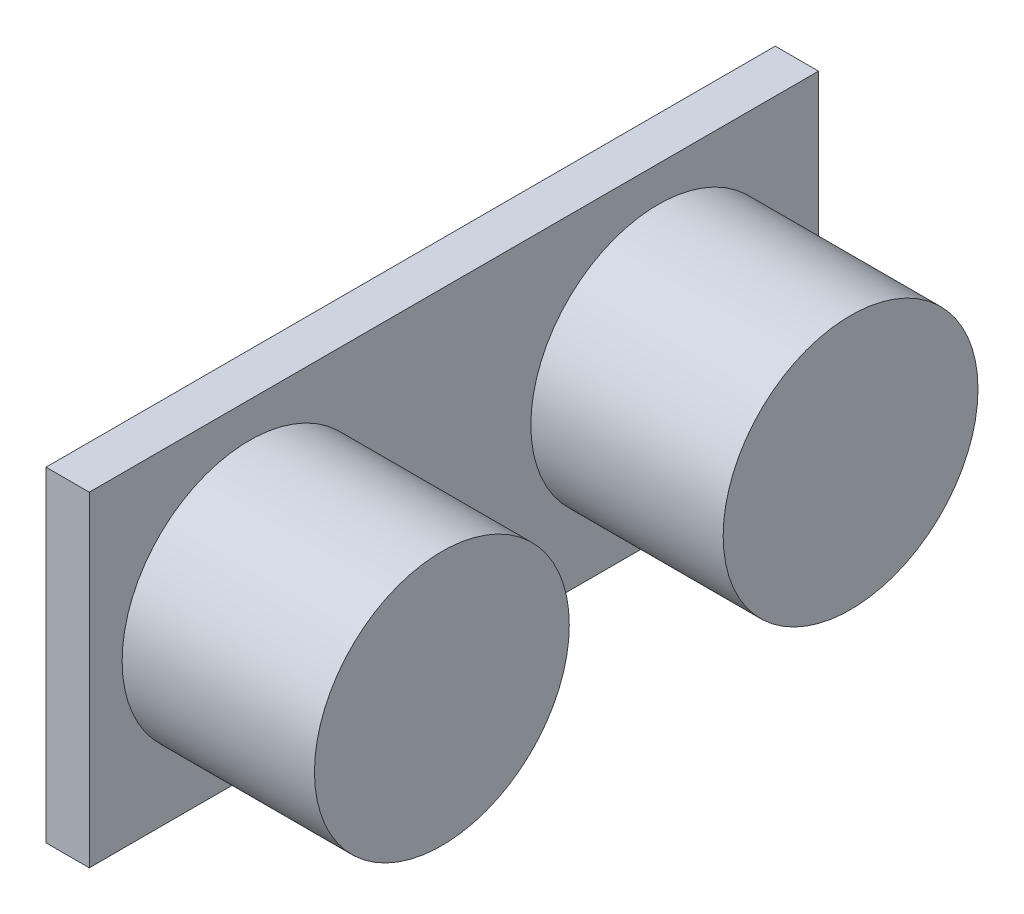
ISO-10303-21;
HEADER;
FILE_DESCRIPTION(('STEP AP214'),'2;1');
FILE_NAME('part.step','',(''),(''),'','','');
FILE_SCHEMA(('AUTOMOTIVE_DESIGN { 1 0 10303 214 1 1 1 1 }'));
ENDSEC;
DATA;
#1=APPLICATION_CONTEXT('core data for automotive mechanical design processes');
#2=APPLICATION_PROTOCOL_DEFINITION('international standard','automotive_design',2000,#1);
#3=PRODUCT_CONTEXT('',#1,'mechanical');
#4=PRODUCT('Part','Part','',(#3));
#5=PRODUCT_RELATED_PRODUCT_CATEGORY('part','',(#4));
#6=PRODUCT_DEFINITION_FORMATION('','',#4);
#7=PRODUCT_DEFINITION_CONTEXT('part definition',#1,'design');
#8=PRODUCT_DEFINITION('design','',#6,#7);
#9=PRODUCT_DEFINITION_SHAPE('','',#8);
#10=(LENGTH_UNIT() NAMED_UNIT(*) SI_UNIT(.MILLI.,.METRE.));
#11=(NAMED_UNIT(*) PLANE_ANGLE_UNIT() SI_UNIT($,.RADIAN.));
#12=(NAMED_UNIT(*) SI_UNIT($,.STERADIAN.) SOLID_ANGLE_UNIT());
#13=UNCERTAINTY_MEASURE_WITH_UNIT(LENGTH_MEASURE(1.E-05),#10,'distance_accuracy_value','');
#14=(GEOMETRIC_REPRESENTATION_CONTEXT(3) GLOBAL_UNCERTAINTY_ASSIGNED_CONTEXT((#13)) GLOBAL_UNIT_ASSIGNED_CONTEXT((#10,
#11,#12)) REPRESENTATION_CONTEXT('',''));
#15=CARTESIAN_POINT('',(0.,0.,0.));
#16=DIRECTION('',(0.,0.,1.));
#17=DIRECTION('',(1.,0.,0.));
#18=AXIS2_PLACEMENT_3D('',#15,#16,#17);
#19=CARTESIAN_POINT('',(2.7,0.,0.));
#20=DIRECTION('',(0.,0.,-1.));
#21=DIRECTION('',(-1.,0.,0.));
#22=AXIS2_PLACEMENT_3D('',#19,#20,#21);
#23=PLANE('',#22);
#24=DIRECTION('',(0.,-1.,0.));
#25=VECTOR('',#24,1.);
#26=CARTESIAN_POINT('',(0.,0.,0.));
#27=LINE('',#26,#25);
#28=CARTESIAN_POINT('',(0.,20.3,0.));
#29=VERTEX_POINT('',#28);
#30=CARTESIAN_POINT('',(0.,0.,0.));
#31=VERTEX_POINT('',#30);
#32=EDGE_CURVE('E111',#29,#31,#27,.T.);
#33=ORIENTED_EDGE('',*,*,#32,.T.);
#34=DIRECTION('',(-1.,0.,0.));
#35=VECTOR('',#34,1.);
#36=CARTESIAN_POINT('',(2.7,0.,0.));
#37=LINE('',#36,#35);
#38=CARTESIAN_POINT('',(2.7,0.,0.));
#39=VERTEX_POINT('',#38);
#40=EDGE_CURVE('E100',#39,#31,#37,.T.);
#41=ORIENTED_EDGE('',*,*,#40,.F.);
#42=DIRECTION('',(0.,-1.,0.));
#43=VECTOR('',#42,1.);
#44=CARTESIAN_POINT('',(2.7,0.,0.));
#45=LINE('',#44,#43);
#46=CARTESIAN_POINT('',(2.7,20.3,0.));
#47=VERTEX_POINT('',#46);
#48=EDGE_CURVE('E92',#47,#39,#45,.T.);
#49=ORIENTED_EDGE('',*,*,#48,.F.);
#50=DIRECTION('',(-1.,0.,0.));
#51=VECTOR('',#50,1.);
#52=CARTESIAN_POINT('',(2.7,20.3,0.));
#53=LINE('',#52,#51);
#54=EDGE_CURVE('E107',#47,#29,#53,.T.);
#55=ORIENTED_EDGE('',*,*,#54,.T.);
#56=EDGE_LOOP('',(#33,#41,#49,#55));
#57=FACE_BOUND('',#56,.T.);
#58=ADVANCED_FACE('F39',(#57),#23,.F.);
#59=CARTESIAN_POINT('',(2.7,0.,0.));
#60=DIRECTION('',(0.,1.,0.));
#61=DIRECTION('',(0.,0.,1.));
#62=AXIS2_PLACEMENT_3D('',#59,#60,#61);
#63=PLANE('',#62);
#64=DIRECTION('',(0.,0.,-1.));
#65=VECTOR('',#64,1.);
#66=CARTESIAN_POINT('',(0.,0.,0.));
#67=LINE('',#66,#65);
#68=CARTESIAN_POINT('',(0.,0.,-45.5));
#69=VERTEX_POINT('',#68);
#70=EDGE_CURVE('E98',#31,#69,#67,.T.);
#71=ORIENTED_EDGE('',*,*,#70,.T.);
#72=DIRECTION('',(-1.,0.,0.));
#73=VECTOR('',#72,1.);
#74=CARTESIAN_POINT('',(2.7,0.,-45.5));
#75=LINE('',#74,#73);
#76=CARTESIAN_POINT('',(2.7,0.,-45.5));
#77=VERTEX_POINT('',#76);
#78=EDGE_CURVE('E96',#77,#69,#75,.T.);
#79=ORIENTED_EDGE('',*,*,#78,.F.);
#80=DIRECTION('',(0.,0.,-1.));
#81=VECTOR('',#80,1.);
#82=CARTESIAN_POINT('',(2.7,0.,0.));
#83=LINE('',#82,#81);
#84=EDGE_CURVE('E87',#39,#77,#83,.T.);
#85=ORIENTED_EDGE('',*,*,#84,.F.);
#86=ORIENTED_EDGE('',*,*,#40,.T.);
#87=EDGE_LOOP('',(#71,#79,#85,#86));
#88=FACE_BOUND('',#87,.T.);
#89=ADVANCED_FACE('F97',(#88),#63,.F.);
#90=CARTESIAN_POINT('',(2.7,0.,-45.5));
#91=DIRECTION('',(0.,0.,1.));
#92=DIRECTION('',(1.,0.,0.));
#93=AXIS2_PLACEMENT_3D('',#90,#91,#92);
#94=PLANE('',#93);
#95=DIRECTION('',(0.,1.,0.));
#96=VECTOR('',#95,1.);
#97=CARTESIAN_POINT('',(0.,0.,-45.5));
#98=LINE('',#97,#96);
#99=CARTESIAN_POINT('',(0.,20.3,-45.5));
#100=VERTEX_POINT('',#99);
#101=EDGE_CURVE('E73',#69,#100,#98,.T.);
#102=ORIENTED_EDGE('',*,*,#101,.T.);
#103=DIRECTION('',(-1.,0.,0.));
#104=VECTOR('',#103,1.);
#105=CARTESIAN_POINT('',(2.7,20.3,-45.5));
#106=LINE('',#105,#104);
#107=CARTESIAN_POINT('',(2.7,20.3,-45.5));
#108=VERTEX_POINT('',#107);
#109=EDGE_CURVE('E101',#108,#100,#106,.T.);
#110=ORIENTED_EDGE('',*,*,#109,.F.);
#111=DIRECTION('',(0.,1.,0.));
#112=VECTOR('',#111,1.);
#113=CARTESIAN_POINT('',(2.7,0.,-45.5));
#114=LINE('',#113,#112);
#115=EDGE_CURVE('E90',#77,#108,#114,.T.);
#116=ORIENTED_EDGE('',*,*,#115,.F.);
#117=ORIENTED_EDGE('',*,*,#78,.T.);
#118=EDGE_LOOP('',(#102,#110,#116,#117));
#119=FACE_BOUND('',#118,.T.);
#120=ADVANCED_FACE('F103',(#119),#94,.F.);
#121=CARTESIAN_POINT('',(2.7,20.3,0.));
#122=DIRECTION('',(0.,-1.,0.));
#123=DIRECTION('',(0.,0.,-1.));
#124=AXIS2_PLACEMENT_3D('',#121,#122,#123);
#125=PLANE('',#124);
#126=DIRECTION('',(0.,0.,1.));
#127=VECTOR('',#126,1.);
#128=CARTESIAN_POINT('',(0.,20.3,0.));
#129=LINE('',#128,#127);
#130=EDGE_CURVE('E79',#100,#29,#129,.T.);
#131=ORIENTED_EDGE('',*,*,#130,.T.);
#132=ORIENTED_EDGE('',*,*,#54,.F.);
#133=DIRECTION('',(0.,0.,1.));
#134=VECTOR('',#133,1.);
#135=CARTESIAN_POINT('',(2.7,20.3,0.));
#136=LINE('',#135,#134);
#137=EDGE_CURVE('E56',#108,#47,#136,.T.);
#138=ORIENTED_EDGE('',*,*,#137,.F.);
#139=ORIENTED_EDGE('',*,*,#109,.T.);
#140=EDGE_LOOP('',(#131,#132,#138,#139));
#141=FACE_BOUND('',#140,.T.);
#142=ADVANCED_FACE('F135',(#141),#125,.F.);
#143=CARTESIAN_POINT('',(2.7,0.,0.));
#144=DIRECTION('',(-1.,0.,0.));
#145=DIRECTION('',(0.,0.,1.));
#146=AXIS2_PLACEMENT_3D('',#143,#144,#145);
#147=PLANE('',#146);
#148=CARTESIAN_POINT('',(2.7,10.15,-35.5));
#149=DIRECTION('',(-1.,0.,0.));
#150=DIRECTION('',(0.,0.,1.));
#151=AXIS2_PLACEMENT_3D('',#148,#149,#150);
#152=CIRCLE('',#151,7.95);
#153=CARTESIAN_POINT('',(2.7,10.15,-27.55));
#154=VERTEX_POINT('',#153);
#155=EDGE_CURVE('E11',#154,#154,#152,.F.);
#156=ORIENTED_EDGE('',*,*,#155,.F.);
#157=EDGE_LOOP('',(#156));
#158=FACE_BOUND('',#157,.T.);
#159=CARTESIAN_POINT('',(2.7,10.15,-10.));
#160=DIRECTION('',(-1.,0.,0.));
#161=DIRECTION('',(0.,0.,1.));
#162=AXIS2_PLACEMENT_3D('',#159,#160,#161);
#163=CIRCLE('',#162,7.95);
#164=CARTESIAN_POINT('',(2.7,10.15,-2.05));
#165=VERTEX_POINT('',#164);
#166=EDGE_CURVE('E48',#165,#165,#163,.F.);
#167=ORIENTED_EDGE('',*,*,#166,.F.);
#168=EDGE_LOOP('',(#167));
#169=FACE_BOUND('',#168,.T.);
#170=ORIENTED_EDGE('',*,*,#48,.T.);
#171=ORIENTED_EDGE('',*,*,#84,.T.);
#172=ORIENTED_EDGE('',*,*,#115,.T.);
#173=ORIENTED_EDGE('',*,*,#137,.T.);
#174=EDGE_LOOP('',(#170,#171,#172,#173));
#175=FACE_BOUND('',#174,.T.);
#176=ADVANCED_FACE('F88',(#158,#169,#175),#147,.F.);
#177=CARTESIAN_POINT('',(0.,0.,0.));
#178=DIRECTION('',(-1.,0.,0.));
#179=DIRECTION('',(0.,0.,1.));
#180=AXIS2_PLACEMENT_3D('',#177,#178,#179);
#181=PLANE('',#180);
#182=ORIENTED_EDGE('',*,*,#32,.F.);
#183=ORIENTED_EDGE('',*,*,#130,.F.);
#184=ORIENTED_EDGE('',*,*,#101,.F.);
#185=ORIENTED_EDGE('',*,*,#70,.F.);
#186=EDGE_LOOP('',(#182,#183,#184,#185));
#187=FACE_BOUND('',#186,.T.);
#188=ADVANCED_FACE('F134',(#187),#181,.T.);
#189=CARTESIAN_POINT('',(14.7,10.15,-10.));
#190=DIRECTION('',(-1.,0.,0.));
#191=DIRECTION('',(0.,0.,1.));
#192=AXIS2_PLACEMENT_3D('',#189,#190,#191);
#193=CYLINDRICAL_SURFACE('',#192,7.95);
#194=CARTESIAN_POINT('',(14.7,10.15,-10.));
#195=DIRECTION('',(1.,0.,0.));
#196=DIRECTION('',(0.,0.,-1.));
#197=AXIS2_PLACEMENT_3D('',#194,#195,#196);
#198=CIRCLE('',#197,7.95);
#199=CARTESIAN_POINT('',(14.7,10.15,-17.95));
#200=VERTEX_POINT('',#199);
#201=EDGE_CURVE('E115',#200,#200,#198,.T.);
#202=ORIENTED_EDGE('',*,*,#201,.F.);
#203=EDGE_LOOP('',(#202));
#204=FACE_BOUND('',#203,.T.);
#205=ORIENTED_EDGE('',*,*,#166,.T.);
#206=EDGE_LOOP('',(#205));
#207=FACE_BOUND('',#206,.T.);
#208=ADVANCED_FACE('F131',(#204,#207),#193,.T.);
#209=CARTESIAN_POINT('',(14.7,10.15,-10.));
#210=DIRECTION('',(1.,0.,0.));
#211=DIRECTION('',(0.,0.,-1.));
#212=AXIS2_PLACEMENT_3D('',#209,#210,#211);
#213=PLANE('',#212);
#214=ORIENTED_EDGE('',*,*,#201,.T.);
#215=EDGE_LOOP('',(#214));
#216=FACE_BOUND('',#215,.T.);
#217=ADVANCED_FACE('F168',(#216),#213,.T.);
#218=CARTESIAN_POINT('',(14.7,10.15,-35.5));
#219=DIRECTION('',(-1.,0.,0.));
#220=DIRECTION('',(0.,0.,1.));
#221=AXIS2_PLACEMENT_3D('',#218,#219,#220);
#222=CYLINDRICAL_SURFACE('',#221,7.95);
#223=CARTESIAN_POINT('',(14.7,10.15,-35.5));
#224=DIRECTION('',(1.,0.,0.));
#225=DIRECTION('',(0.,0.,-1.));
#226=AXIS2_PLACEMENT_3D('',#223,#224,#225);
#227=CIRCLE('',#226,7.95);
#228=CARTESIAN_POINT('',(14.7,10.15,-43.45));
#229=VERTEX_POINT('',#228);
#230=EDGE_CURVE('E158',#229,#229,#227,.T.);
#231=ORIENTED_EDGE('',*,*,#230,.F.);
#232=EDGE_LOOP('',(#231));
#233=FACE_BOUND('',#232,.T.);
#234=ORIENTED_EDGE('',*,*,#155,.T.);
#235=EDGE_LOOP('',(#234));
#236=FACE_BOUND('',#235,.T.);
#237=ADVANCED_FACE('F165',(#233,#236),#222,.T.);
#238=CARTESIAN_POINT('',(14.7,10.15,-35.5));
#239=DIRECTION('',(1.,0.,0.));
#240=DIRECTION('',(0.,0.,-1.));
#241=AXIS2_PLACEMENT_3D('',#238,#239,#240);
#242=PLANE('',#241);
#243=ORIENTED_EDGE('',*,*,#230,.T.);
#244=EDGE_LOOP('',(#243));
#245=FACE_BOUND('',#244,.T.);
#246=ADVANCED_FACE('F163',(#245),#242,.T.);
#247=CLOSED_SHELL('',(#58,#89,#120,#142,#176,#188,#208,#217,#237,#246));
#248=MANIFOLD_SOLID_BREP('B2',#247);
#249=ADVANCED_BREP_SHAPE_REPRESENTATION('',(#18,#248),#14);
#250=SHAPE_DEFINITION_REPRESENTATION(#9,#249);
ENDSEC;
END-ISO-10303-21;
